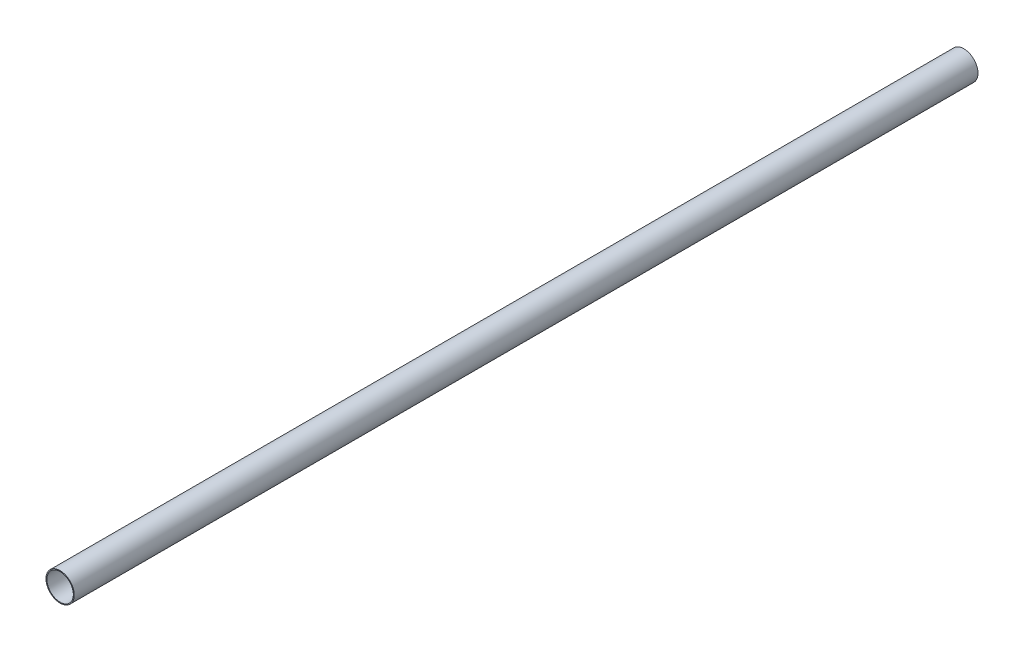
ISO-10303-21;
HEADER;
FILE_DESCRIPTION(('STEP AP214'),'2;1');
FILE_NAME('part.step','',(''),(''),'','','');
FILE_SCHEMA(('AUTOMOTIVE_DESIGN { 1 0 10303 214 1 1 1 1 }'));
ENDSEC;
DATA;
#1=APPLICATION_CONTEXT('core data for automotive mechanical design processes');
#2=APPLICATION_PROTOCOL_DEFINITION('international standard','automotive_design',2000,#1);
#3=PRODUCT_CONTEXT('',#1,'mechanical');
#4=PRODUCT('Part','Part','',(#3));
#5=PRODUCT_RELATED_PRODUCT_CATEGORY('part','',(#4));
#6=PRODUCT_DEFINITION_FORMATION('','',#4);
#7=PRODUCT_DEFINITION_CONTEXT('part definition',#1,'design');
#8=PRODUCT_DEFINITION('design','',#6,#7);
#9=PRODUCT_DEFINITION_SHAPE('','',#8);
#10=(LENGTH_UNIT() NAMED_UNIT(*) SI_UNIT(.MILLI.,.METRE.));
#11=(NAMED_UNIT(*) PLANE_ANGLE_UNIT() SI_UNIT($,.RADIAN.));
#12=(NAMED_UNIT(*) SI_UNIT($,.STERADIAN.) SOLID_ANGLE_UNIT());
#13=UNCERTAINTY_MEASURE_WITH_UNIT(LENGTH_MEASURE(1.E-05),#10,'distance_accuracy_value','');
#14=(GEOMETRIC_REPRESENTATION_CONTEXT(3) GLOBAL_UNCERTAINTY_ASSIGNED_CONTEXT((#13)) GLOBAL_UNIT_ASSIGNED_CONTEXT((#10,
#11,#12)) REPRESENTATION_CONTEXT('',''));
#15=CARTESIAN_POINT('',(0.,0.,0.));
#16=DIRECTION('',(0.,0.,1.));
#17=DIRECTION('',(1.,0.,0.));
#18=AXIS2_PLACEMENT_3D('',#15,#16,#17);
#19=CARTESIAN_POINT('',(0.,0.,457.2));
#20=DIRECTION('',(0.,0.,1.));
#21=DIRECTION('',(1.,0.,0.));
#22=AXIS2_PLACEMENT_3D('',#19,#20,#21);
#23=PLANE('',#22);
#24=CARTESIAN_POINT('',(0.,0.,457.2));
#25=DIRECTION('',(0.,0.,1.));
#26=DIRECTION('',(1.,0.,0.));
#27=AXIS2_PLACEMENT_3D('',#24,#25,#26);
#28=CIRCLE('',#27,14.2875);
#29=CARTESIAN_POINT('',(14.2875,0.,457.2));
#30=VERTEX_POINT('',#29);
#31=EDGE_CURVE('E10',#30,#30,#28,.T.);
#32=ORIENTED_EDGE('',*,*,#31,.T.);
#33=EDGE_LOOP('',(#32));
#34=FACE_BOUND('',#33,.T.);
#35=CARTESIAN_POINT('',(0.,0.,457.2));
#36=DIRECTION('',(0.,0.,1.));
#37=DIRECTION('',(1.,0.,0.));
#38=AXIS2_PLACEMENT_3D('',#35,#36,#37);
#39=CIRCLE('',#38,13.3985);
#40=CARTESIAN_POINT('',(13.3985,0.,457.2));
#41=VERTEX_POINT('',#40);
#42=EDGE_CURVE('E41',#41,#41,#39,.T.);
#43=ORIENTED_EDGE('',*,*,#42,.F.);
#44=EDGE_LOOP('',(#43));
#45=FACE_BOUND('',#44,.T.);
#46=ADVANCED_FACE('F30',(#34,#45),#23,.T.);
#47=CARTESIAN_POINT('',(0.,0.,-457.2));
#48=DIRECTION('',(0.,0.,1.));
#49=DIRECTION('',(1.,0.,0.));
#50=AXIS2_PLACEMENT_3D('',#47,#48,#49);
#51=PLANE('',#50);
#52=CARTESIAN_POINT('',(0.,0.,-457.2));
#53=DIRECTION('',(0.,0.,1.));
#54=DIRECTION('',(1.,0.,0.));
#55=AXIS2_PLACEMENT_3D('',#52,#53,#54);
#56=CIRCLE('',#55,14.2875);
#57=CARTESIAN_POINT('',(14.2875,0.,-457.2));
#58=VERTEX_POINT('',#57);
#59=EDGE_CURVE('E34',#58,#58,#56,.T.);
#60=ORIENTED_EDGE('',*,*,#59,.F.);
#61=EDGE_LOOP('',(#60));
#62=FACE_BOUND('',#61,.T.);
#63=CARTESIAN_POINT('',(0.,0.,-457.2));
#64=DIRECTION('',(0.,0.,1.));
#65=DIRECTION('',(1.,0.,0.));
#66=AXIS2_PLACEMENT_3D('',#63,#64,#65);
#67=CIRCLE('',#66,13.3985);
#68=CARTESIAN_POINT('',(13.3985,0.,-457.2));
#69=VERTEX_POINT('',#68);
#70=EDGE_CURVE('E43',#69,#69,#67,.T.);
#71=ORIENTED_EDGE('',*,*,#70,.T.);
#72=EDGE_LOOP('',(#71));
#73=FACE_BOUND('',#72,.T.);
#74=ADVANCED_FACE('F53',(#62,#73),#51,.F.);
#75=CARTESIAN_POINT('',(0.,0.,457.2));
#76=DIRECTION('',(0.,0.,-1.));
#77=DIRECTION('',(-1.,0.,0.));
#78=AXIS2_PLACEMENT_3D('',#75,#76,#77);
#79=CYLINDRICAL_SURFACE('',#78,14.2875);
#80=ORIENTED_EDGE('',*,*,#31,.F.);
#81=EDGE_LOOP('',(#80));
#82=FACE_BOUND('',#81,.T.);
#83=ORIENTED_EDGE('',*,*,#59,.T.);
#84=EDGE_LOOP('',(#83));
#85=FACE_BOUND('',#84,.T.);
#86=ADVANCED_FACE('F32',(#82,#85),#79,.T.);
#87=CARTESIAN_POINT('',(0.,0.,457.2));
#88=DIRECTION('',(0.,0.,-1.));
#89=DIRECTION('',(-1.,0.,0.));
#90=AXIS2_PLACEMENT_3D('',#87,#88,#89);
#91=CYLINDRICAL_SURFACE('',#90,13.3985);
#92=ORIENTED_EDGE('',*,*,#42,.T.);
#93=EDGE_LOOP('',(#92));
#94=FACE_BOUND('',#93,.T.);
#95=ORIENTED_EDGE('',*,*,#70,.F.);
#96=EDGE_LOOP('',(#95));
#97=FACE_BOUND('',#96,.T.);
#98=ADVANCED_FACE('F49',(#94,#97),#91,.F.);
#99=CLOSED_SHELL('',(#46,#74,#86,#98));
#100=MANIFOLD_SOLID_BREP('B2',#99);
#101=ADVANCED_BREP_SHAPE_REPRESENTATION('',(#18,#100),#14);
#102=SHAPE_DEFINITION_REPRESENTATION(#9,#101);
ENDSEC;
END-ISO-10303-21;
